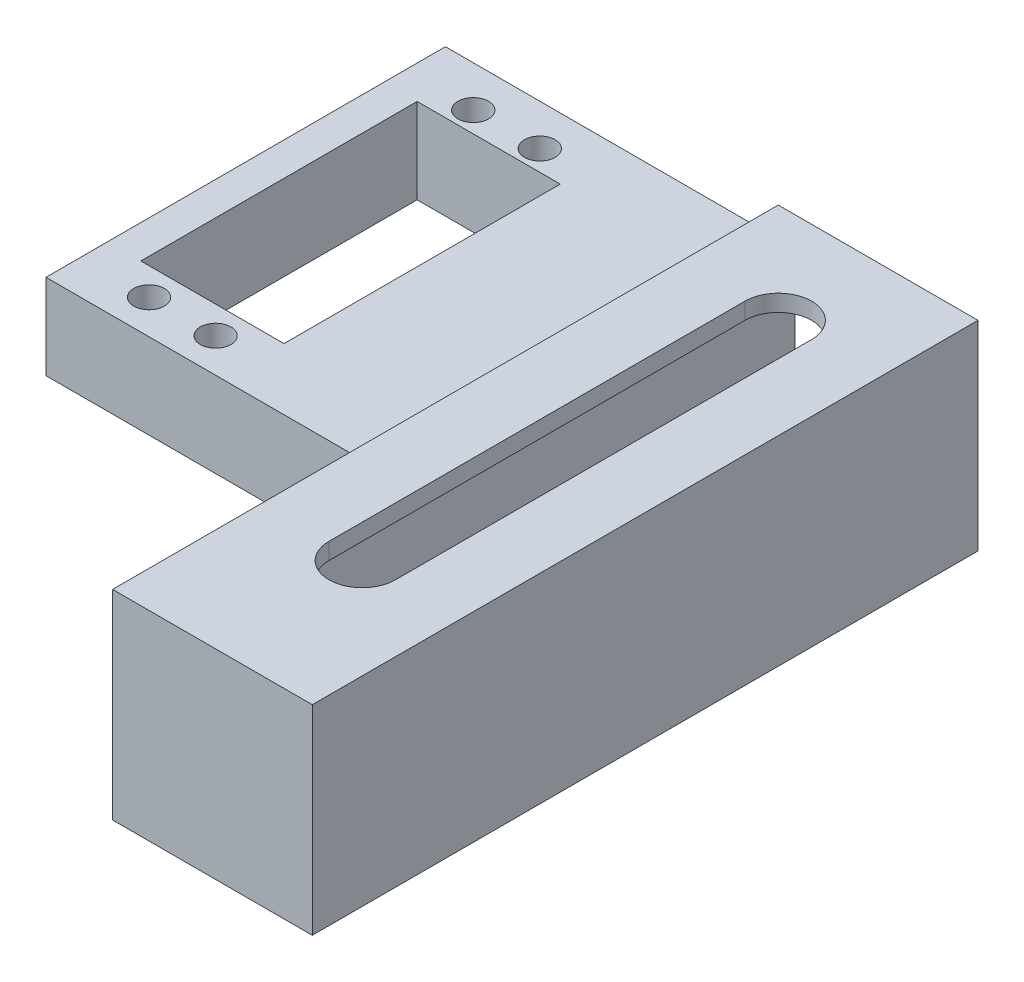
ISO-10303-21;
HEADER;
FILE_DESCRIPTION(('STEP AP214'),'2;1');
FILE_NAME('part.step','',(''),(''),'','','');
FILE_SCHEMA(('AUTOMOTIVE_DESIGN { 1 0 10303 214 1 1 1 1 }'));
ENDSEC;
DATA;
#1=APPLICATION_CONTEXT('core data for automotive mechanical design processes');
#2=APPLICATION_PROTOCOL_DEFINITION('international standard','automotive_design',2000,#1);
#3=PRODUCT_CONTEXT('',#1,'mechanical');
#4=PRODUCT('Part','Part','',(#3));
#5=PRODUCT_RELATED_PRODUCT_CATEGORY('part','',(#4));
#6=PRODUCT_DEFINITION_FORMATION('','',#4);
#7=PRODUCT_DEFINITION_CONTEXT('part definition',#1,'design');
#8=PRODUCT_DEFINITION('design','',#6,#7);
#9=PRODUCT_DEFINITION_SHAPE('','',#8);
#10=(LENGTH_UNIT() NAMED_UNIT(*) SI_UNIT(.MILLI.,.METRE.));
#11=(NAMED_UNIT(*) PLANE_ANGLE_UNIT() SI_UNIT($,.RADIAN.));
#12=(NAMED_UNIT(*) SI_UNIT($,.STERADIAN.) SOLID_ANGLE_UNIT());
#13=UNCERTAINTY_MEASURE_WITH_UNIT(LENGTH_MEASURE(1.E-05),#10,'distance_accuracy_value','');
#14=(GEOMETRIC_REPRESENTATION_CONTEXT(3) GLOBAL_UNCERTAINTY_ASSIGNED_CONTEXT((#13)) GLOBAL_UNIT_ASSIGNED_CONTEXT((#10,
#11,#12)) REPRESENTATION_CONTEXT('',''));
#15=CARTESIAN_POINT('',(0.,0.,0.));
#16=DIRECTION('',(0.,0.,1.));
#17=DIRECTION('',(1.,0.,0.));
#18=AXIS2_PLACEMENT_3D('',#15,#16,#17);
#19=CARTESIAN_POINT('',(-30.,0.,100.));
#20=DIRECTION('',(1.,0.,0.));
#21=DIRECTION('',(0.,0.,-1.));
#22=AXIS2_PLACEMENT_3D('',#19,#20,#21);
#23=PLANE('',#22);
#24=DIRECTION('',(0.,1.,0.));
#25=VECTOR('',#24,1.);
#26=CARTESIAN_POINT('',(-30.,-4.4,60.));
#27=LINE('',#26,#25);
#28=CARTESIAN_POINT('',(-30.,-17.2,60.));
#29=VERTEX_POINT('',#28);
#30=CARTESIAN_POINT('',(-30.,-4.4,60.));
#31=VERTEX_POINT('',#30);
#32=EDGE_CURVE('E257',#29,#31,#27,.T.);
#33=ORIENTED_EDGE('',*,*,#32,.F.);
#34=DIRECTION('',(0.,0.,-1.));
#35=VECTOR('',#34,1.);
#36=CARTESIAN_POINT('',(-30.,-17.2,100.));
#37=LINE('',#36,#35);
#38=CARTESIAN_POINT('',(-30.,-17.2,0.));
#39=VERTEX_POINT('',#38);
#40=EDGE_CURVE('E190',#29,#39,#37,.T.);
#41=ORIENTED_EDGE('',*,*,#40,.T.);
#42=DIRECTION('',(0.,-1.,0.));
#43=VECTOR('',#42,1.);
#44=CARTESIAN_POINT('',(-30.,-17.2,0.));
#45=LINE('',#44,#43);
#46=CARTESIAN_POINT('',(-30.,-30.,0.));
#47=VERTEX_POINT('',#46);
#48=EDGE_CURVE('E188',#39,#47,#45,.T.);
#49=ORIENTED_EDGE('',*,*,#48,.T.);
#50=DIRECTION('',(0.,0.,-1.));
#51=VECTOR('',#50,1.);
#52=CARTESIAN_POINT('',(-30.,-30.,100.));
#53=LINE('',#52,#51);
#54=CARTESIAN_POINT('',(-30.,-30.,100.));
#55=VERTEX_POINT('',#54);
#56=EDGE_CURVE('E174',#55,#47,#53,.T.);
#57=ORIENTED_EDGE('',*,*,#56,.F.);
#58=DIRECTION('',(0.,-1.,0.));
#59=VECTOR('',#58,1.);
#60=CARTESIAN_POINT('',(-30.,0.,100.));
#61=LINE('',#60,#59);
#62=CARTESIAN_POINT('',(-30.,0.,100.));
#63=VERTEX_POINT('',#62);
#64=EDGE_CURVE('E329',#63,#55,#61,.T.);
#65=ORIENTED_EDGE('',*,*,#64,.F.);
#66=DIRECTION('',(0.,0.,-1.));
#67=VECTOR('',#66,1.);
#68=CARTESIAN_POINT('',(-30.,0.,100.));
#69=LINE('',#68,#67);
#70=CARTESIAN_POINT('',(-30.,0.,0.));
#71=VERTEX_POINT('',#70);
#72=EDGE_CURVE('E184',#63,#71,#69,.T.);
#73=ORIENTED_EDGE('',*,*,#72,.T.);
#74=DIRECTION('',(0.,-1.,0.));
#75=VECTOR('',#74,1.);
#76=CARTESIAN_POINT('',(-30.,0.,0.));
#77=LINE('',#76,#75);
#78=CARTESIAN_POINT('',(-30.,-4.4,0.));
#79=VERTEX_POINT('',#78);
#80=EDGE_CURVE('E202',#71,#79,#77,.T.);
#81=ORIENTED_EDGE('',*,*,#80,.T.);
#82=DIRECTION('',(0.,0.,-1.));
#83=VECTOR('',#82,1.);
#84=CARTESIAN_POINT('',(-30.,-4.4,60.));
#85=LINE('',#84,#83);
#86=EDGE_CURVE('E251',#31,#79,#85,.T.);
#87=ORIENTED_EDGE('',*,*,#86,.F.);
#88=EDGE_LOOP('',(#33,#41,#49,#57,#65,#73,#81,#87));
#89=FACE_BOUND('',#88,.T.);
#90=ADVANCED_FACE('F35',(#89),#23,.F.);
#91=CARTESIAN_POINT('',(0.,0.,100.));
#92=DIRECTION('',(-1.,0.,0.));
#93=DIRECTION('',(0.,0.,1.));
#94=AXIS2_PLACEMENT_3D('',#91,#92,#93);
#95=PLANE('',#94);
#96=DIRECTION('',(0.,1.,0.));
#97=VECTOR('',#96,1.);
#98=CARTESIAN_POINT('',(0.,0.,0.));
#99=LINE('',#98,#97);
#100=CARTESIAN_POINT('',(0.,-30.,0.));
#101=VERTEX_POINT('',#100);
#102=CARTESIAN_POINT('',(0.,0.,0.));
#103=VERTEX_POINT('',#102);
#104=EDGE_CURVE('E200',#101,#103,#99,.T.);
#105=ORIENTED_EDGE('',*,*,#104,.T.);
#106=DIRECTION('',(0.,0.,-1.));
#107=VECTOR('',#106,1.);
#108=CARTESIAN_POINT('',(0.,0.,100.));
#109=LINE('',#108,#107);
#110=CARTESIAN_POINT('',(0.,0.,100.));
#111=VERTEX_POINT('',#110);
#112=EDGE_CURVE('E214',#111,#103,#109,.T.);
#113=ORIENTED_EDGE('',*,*,#112,.F.);
#114=DIRECTION('',(0.,1.,0.));
#115=VECTOR('',#114,1.);
#116=CARTESIAN_POINT('',(0.,0.,100.));
#117=LINE('',#116,#115);
#118=CARTESIAN_POINT('',(0.,-30.,100.));
#119=VERTEX_POINT('',#118);
#120=EDGE_CURVE('E201',#119,#111,#117,.T.);
#121=ORIENTED_EDGE('',*,*,#120,.F.);
#122=DIRECTION('',(0.,0.,-1.));
#123=VECTOR('',#122,1.);
#124=CARTESIAN_POINT('',(0.,-30.,100.));
#125=LINE('',#124,#123);
#126=EDGE_CURVE('E185',#119,#101,#125,.T.);
#127=ORIENTED_EDGE('',*,*,#126,.T.);
#128=EDGE_LOOP('',(#105,#113,#121,#127));
#129=FACE_BOUND('',#128,.T.);
#130=ADVANCED_FACE('F37',(#129),#95,.F.);
#131=CARTESIAN_POINT('',(0.,0.,100.));
#132=DIRECTION('',(0.,-1.,0.));
#133=DIRECTION('',(0.,0.,-1.));
#134=AXIS2_PLACEMENT_3D('',#131,#132,#133);
#135=PLANE('',#134);
#136=DIRECTION('',(0.,0.,1.));
#137=VECTOR('',#136,1.);
#138=CARTESIAN_POINT('',(-20.,0.,15.));
#139=LINE('',#138,#137);
#140=CARTESIAN_POINT('',(-20.,0.,15.));
#141=VERTEX_POINT('',#140);
#142=CARTESIAN_POINT('',(-20.,0.,77.5));
#143=VERTEX_POINT('',#142);
#144=EDGE_CURVE('E278',#141,#143,#139,.T.);
#145=ORIENTED_EDGE('',*,*,#144,.F.);
#146=CARTESIAN_POINT('',(-15.,0.,15.));
#147=DIRECTION('',(0.,1.,0.));
#148=DIRECTION('',(0.,0.,1.));
#149=AXIS2_PLACEMENT_3D('',#146,#147,#148);
#150=CIRCLE('',#149,5.);
#151=CARTESIAN_POINT('',(-10.,0.,15.));
#152=VERTEX_POINT('',#151);
#153=EDGE_CURVE('E267',#152,#141,#150,.T.);
#154=ORIENTED_EDGE('',*,*,#153,.F.);
#155=DIRECTION('',(0.,0.,-1.));
#156=VECTOR('',#155,1.);
#157=CARTESIAN_POINT('',(-10.,0.,15.));
#158=LINE('',#157,#156);
#159=CARTESIAN_POINT('',(-9.99999999999999,0.,77.5));
#160=VERTEX_POINT('',#159);
#161=EDGE_CURVE('E284',#160,#152,#158,.T.);
#162=ORIENTED_EDGE('',*,*,#161,.F.);
#163=CARTESIAN_POINT('',(-15.,0.,77.5));
#164=DIRECTION('',(0.,1.,0.));
#165=DIRECTION('',(0.,0.,1.));
#166=AXIS2_PLACEMENT_3D('',#163,#164,#165);
#167=CIRCLE('',#166,5.);
#168=EDGE_CURVE('E281',#143,#160,#167,.T.);
#169=ORIENTED_EDGE('',*,*,#168,.F.);
#170=EDGE_LOOP('',(#145,#154,#162,#169));
#171=FACE_BOUND('',#170,.T.);
#172=DIRECTION('',(-1.,0.,0.));
#173=VECTOR('',#172,1.);
#174=CARTESIAN_POINT('',(0.,0.,0.));
#175=LINE('',#174,#173);
#176=EDGE_CURVE('E207',#103,#71,#175,.T.);
#177=ORIENTED_EDGE('',*,*,#176,.T.);
#178=ORIENTED_EDGE('',*,*,#72,.F.);
#179=DIRECTION('',(-1.,0.,0.));
#180=VECTOR('',#179,1.);
#181=CARTESIAN_POINT('',(0.,0.,100.));
#182=LINE('',#181,#180);
#183=EDGE_CURVE('E205',#111,#63,#182,.T.);
#184=ORIENTED_EDGE('',*,*,#183,.F.);
#185=ORIENTED_EDGE('',*,*,#112,.T.);
#186=EDGE_LOOP('',(#177,#178,#184,#185));
#187=FACE_BOUND('',#186,.T.);
#188=ADVANCED_FACE('F334',(#171,#187),#135,.F.);
#189=CARTESIAN_POINT('',(0.,-30.,100.));
#190=DIRECTION('',(0.,1.,0.));
#191=DIRECTION('',(0.,0.,1.));
#192=AXIS2_PLACEMENT_3D('',#189,#190,#191);
#193=PLANE('',#192);
#194=ORIENTED_EDGE('',*,*,#56,.T.);
#195=DIRECTION('',(1.,0.,0.));
#196=VECTOR('',#195,1.);
#197=CARTESIAN_POINT('',(0.,-30.,0.));
#198=LINE('',#197,#196);
#199=EDGE_CURVE('E179',#47,#101,#198,.T.);
#200=ORIENTED_EDGE('',*,*,#199,.T.);
#201=ORIENTED_EDGE('',*,*,#126,.F.);
#202=DIRECTION('',(1.,0.,0.));
#203=VECTOR('',#202,1.);
#204=CARTESIAN_POINT('',(0.,-30.,100.));
#205=LINE('',#204,#203);
#206=EDGE_CURVE('E181',#55,#119,#205,.T.);
#207=ORIENTED_EDGE('',*,*,#206,.F.);
#208=EDGE_LOOP('',(#194,#200,#201,#207));
#209=FACE_BOUND('',#208,.T.);
#210=ADVANCED_FACE('F176',(#209),#193,.F.);
#211=CARTESIAN_POINT('',(0.,0.,100.));
#212=DIRECTION('',(0.,0.,-1.));
#213=DIRECTION('',(-1.,0.,0.));
#214=AXIS2_PLACEMENT_3D('',#211,#212,#213);
#215=PLANE('',#214);
#216=ORIENTED_EDGE('',*,*,#120,.T.);
#217=ORIENTED_EDGE('',*,*,#183,.T.);
#218=ORIENTED_EDGE('',*,*,#64,.T.);
#219=ORIENTED_EDGE('',*,*,#206,.T.);
#220=EDGE_LOOP('',(#216,#217,#218,#219));
#221=FACE_BOUND('',#220,.T.);
#222=ADVANCED_FACE('F390',(#221),#215,.F.);
#223=CARTESIAN_POINT('',(0.,0.,0.));
#224=DIRECTION('',(0.,0.,-1.));
#225=DIRECTION('',(-1.,0.,0.));
#226=AXIS2_PLACEMENT_3D('',#223,#224,#225);
#227=PLANE('',#226);
#228=ORIENTED_EDGE('',*,*,#48,.F.);
#229=DIRECTION('',(1.,0.,0.));
#230=VECTOR('',#229,1.);
#231=CARTESIAN_POINT('',(-30.,-17.2,0.));
#232=LINE('',#231,#230);
#233=CARTESIAN_POINT('',(-80.,-17.2,0.));
#234=VERTEX_POINT('',#233);
#235=EDGE_CURVE('E194',#234,#39,#232,.T.);
#236=ORIENTED_EDGE('',*,*,#235,.F.);
#237=DIRECTION('',(0.,-1.,0.));
#238=VECTOR('',#237,1.);
#239=CARTESIAN_POINT('',(-80.,-4.4,0.));
#240=LINE('',#239,#238);
#241=CARTESIAN_POINT('',(-80.,-4.4,0.));
#242=VERTEX_POINT('',#241);
#243=EDGE_CURVE('E253',#242,#234,#240,.T.);
#244=ORIENTED_EDGE('',*,*,#243,.F.);
#245=DIRECTION('',(1.,0.,0.));
#246=VECTOR('',#245,1.);
#247=CARTESIAN_POINT('',(-80.,-4.4,0.));
#248=LINE('',#247,#246);
#249=EDGE_CURVE('E256',#242,#79,#248,.T.);
#250=ORIENTED_EDGE('',*,*,#249,.T.);
#251=ORIENTED_EDGE('',*,*,#80,.F.);
#252=ORIENTED_EDGE('',*,*,#176,.F.);
#253=ORIENTED_EDGE('',*,*,#104,.F.);
#254=ORIENTED_EDGE('',*,*,#199,.F.);
#255=EDGE_LOOP('',(#228,#236,#244,#250,#251,#252,#253,#254));
#256=FACE_BOUND('',#255,.T.);
#257=DIRECTION('',(0.,-1.,0.));
#258=VECTOR('',#257,1.);
#259=CARTESIAN_POINT('',(-2.5,-2.5,0.));
#260=LINE('',#259,#258);
#261=CARTESIAN_POINT('',(-2.5,-2.5,0.));
#262=VERTEX_POINT('',#261);
#263=CARTESIAN_POINT('',(-2.5,-27.5,0.));
#264=VERTEX_POINT('',#263);
#265=EDGE_CURVE('E296',#262,#264,#260,.T.);
#266=ORIENTED_EDGE('',*,*,#265,.F.);
#267=DIRECTION('',(1.,0.,0.));
#268=VECTOR('',#267,1.);
#269=CARTESIAN_POINT('',(-2.5,-2.5,0.));
#270=LINE('',#269,#268);
#271=CARTESIAN_POINT('',(-27.5,-2.5,0.));
#272=VERTEX_POINT('',#271);
#273=EDGE_CURVE('E301',#272,#262,#270,.T.);
#274=ORIENTED_EDGE('',*,*,#273,.F.);
#275=DIRECTION('',(0.,1.,0.));
#276=VECTOR('',#275,1.);
#277=CARTESIAN_POINT('',(-27.5,-2.5,0.));
#278=LINE('',#277,#276);
#279=CARTESIAN_POINT('',(-27.5,-27.5,0.));
#280=VERTEX_POINT('',#279);
#281=EDGE_CURVE('E315',#280,#272,#278,.T.);
#282=ORIENTED_EDGE('',*,*,#281,.F.);
#283=DIRECTION('',(-1.,0.,0.));
#284=VECTOR('',#283,1.);
#285=CARTESIAN_POINT('',(-2.5,-27.5,0.));
#286=LINE('',#285,#284);
#287=EDGE_CURVE('E312',#264,#280,#286,.T.);
#288=ORIENTED_EDGE('',*,*,#287,.F.);
#289=EDGE_LOOP('',(#266,#274,#282,#288));
#290=FACE_BOUND('',#289,.T.);
#291=ADVANCED_FACE('F197',(#256,#290),#227,.T.);
#292=CARTESIAN_POINT('',(-2.5,-2.5,95.));
#293=DIRECTION('',(1.,0.,0.));
#294=DIRECTION('',(0.,1.,0.));
#295=AXIS2_PLACEMENT_3D('',#292,#293,#294);
#296=PLANE('',#295);
#297=ORIENTED_EDGE('',*,*,#265,.T.);
#298=DIRECTION('',(0.,0.,-1.));
#299=VECTOR('',#298,1.);
#300=CARTESIAN_POINT('',(-2.5,-27.5,95.));
#301=LINE('',#300,#299);
#302=CARTESIAN_POINT('',(-2.5,-27.5,95.));
#303=VERTEX_POINT('',#302);
#304=EDGE_CURVE('E310',#303,#264,#301,.T.);
#305=ORIENTED_EDGE('',*,*,#304,.F.);
#306=DIRECTION('',(0.,-1.,0.));
#307=VECTOR('',#306,1.);
#308=CARTESIAN_POINT('',(-2.5,-2.5,95.));
#309=LINE('',#308,#307);
#310=CARTESIAN_POINT('',(-2.5,-2.5,95.));
#311=VERTEX_POINT('',#310);
#312=EDGE_CURVE('E297',#311,#303,#309,.T.);
#313=ORIENTED_EDGE('',*,*,#312,.F.);
#314=DIRECTION('',(0.,0.,-1.));
#315=VECTOR('',#314,1.);
#316=CARTESIAN_POINT('',(-2.5,-2.5,95.));
#317=LINE('',#316,#315);
#318=EDGE_CURVE('E320',#311,#262,#317,.T.);
#319=ORIENTED_EDGE('',*,*,#318,.T.);
#320=EDGE_LOOP('',(#297,#305,#313,#319));
#321=FACE_BOUND('',#320,.T.);
#322=ADVANCED_FACE('F433',(#321),#296,.F.);
#323=CARTESIAN_POINT('',(-2.5,-2.5,95.));
#324=DIRECTION('',(0.,1.,0.));
#325=DIRECTION('',(-1.,0.,0.));
#326=AXIS2_PLACEMENT_3D('',#323,#324,#325);
#327=PLANE('',#326);
#328=DIRECTION('',(0.,0.,1.));
#329=VECTOR('',#328,1.);
#330=CARTESIAN_POINT('',(-10.,-2.5,15.));
#331=LINE('',#330,#329);
#332=CARTESIAN_POINT('',(-10.,-2.5,15.));
#333=VERTEX_POINT('',#332);
#334=CARTESIAN_POINT('',(-9.99999999999999,-2.5,77.5));
#335=VERTEX_POINT('',#334);
#336=EDGE_CURVE('E271',#333,#335,#331,.T.);
#337=ORIENTED_EDGE('',*,*,#336,.F.);
#338=CARTESIAN_POINT('',(-15.,-2.5,15.));
#339=DIRECTION('',(0.,1.,0.));
#340=DIRECTION('',(-1.,0.,0.));
#341=AXIS2_PLACEMENT_3D('',#338,#339,#340);
#342=CIRCLE('',#341,5.);
#343=CARTESIAN_POINT('',(-20.,-2.5,15.));
#344=VERTEX_POINT('',#343);
#345=EDGE_CURVE('E274',#344,#333,#342,.F.);
#346=ORIENTED_EDGE('',*,*,#345,.F.);
#347=DIRECTION('',(0.,0.,-1.));
#348=VECTOR('',#347,1.);
#349=CARTESIAN_POINT('',(-20.,-2.5,15.));
#350=LINE('',#349,#348);
#351=CARTESIAN_POINT('',(-20.,-2.5,77.5));
#352=VERTEX_POINT('',#351);
#353=EDGE_CURVE('E276',#352,#344,#350,.T.);
#354=ORIENTED_EDGE('',*,*,#353,.F.);
#355=CARTESIAN_POINT('',(-15.,-2.5,77.5));
#356=DIRECTION('',(0.,1.,0.));
#357=DIRECTION('',(-1.,0.,0.));
#358=AXIS2_PLACEMENT_3D('',#355,#356,#357);
#359=CIRCLE('',#358,5.);
#360=EDGE_CURVE('E268',#335,#352,#359,.F.);
#361=ORIENTED_EDGE('',*,*,#360,.F.);
#362=EDGE_LOOP('',(#337,#346,#354,#361));
#363=FACE_BOUND('',#362,.T.);
#364=ORIENTED_EDGE('',*,*,#273,.T.);
#365=ORIENTED_EDGE('',*,*,#318,.F.);
#366=DIRECTION('',(1.,0.,0.));
#367=VECTOR('',#366,1.);
#368=CARTESIAN_POINT('',(-2.5,-2.5,95.));
#369=LINE('',#368,#367);
#370=CARTESIAN_POINT('',(-27.5,-2.5,95.));
#371=VERTEX_POINT('',#370);
#372=EDGE_CURVE('E307',#371,#311,#369,.T.);
#373=ORIENTED_EDGE('',*,*,#372,.F.);
#374=DIRECTION('',(0.,0.,-1.));
#375=VECTOR('',#374,1.);
#376=CARTESIAN_POINT('',(-27.5,-2.5,95.));
#377=LINE('',#376,#375);
#378=EDGE_CURVE('E322',#371,#272,#377,.T.);
#379=ORIENTED_EDGE('',*,*,#378,.T.);
#380=EDGE_LOOP('',(#364,#365,#373,#379));
#381=FACE_BOUND('',#380,.T.);
#382=ADVANCED_FACE('F405',(#363,#381),#327,.F.);
#383=CARTESIAN_POINT('',(-27.5,-2.5,95.));
#384=DIRECTION('',(-1.,0.,0.));
#385=DIRECTION('',(0.,-1.,0.));
#386=AXIS2_PLACEMENT_3D('',#383,#384,#385);
#387=PLANE('',#386);
#388=ORIENTED_EDGE('',*,*,#281,.T.);
#389=ORIENTED_EDGE('',*,*,#378,.F.);
#390=DIRECTION('',(0.,1.,0.));
#391=VECTOR('',#390,1.);
#392=CARTESIAN_POINT('',(-27.5,-2.5,95.));
#393=LINE('',#392,#391);
#394=CARTESIAN_POINT('',(-27.5,-27.5,95.));
#395=VERTEX_POINT('',#394);
#396=EDGE_CURVE('E304',#395,#371,#393,.T.);
#397=ORIENTED_EDGE('',*,*,#396,.F.);
#398=DIRECTION('',(0.,0.,-1.));
#399=VECTOR('',#398,1.);
#400=CARTESIAN_POINT('',(-27.5,-27.5,95.));
#401=LINE('',#400,#399);
#402=EDGE_CURVE('E324',#395,#280,#401,.T.);
#403=ORIENTED_EDGE('',*,*,#402,.T.);
#404=EDGE_LOOP('',(#388,#389,#397,#403));
#405=FACE_BOUND('',#404,.T.);
#406=ADVANCED_FACE('F432',(#405),#387,.F.);
#407=CARTESIAN_POINT('',(-2.5,-27.5,95.));
#408=DIRECTION('',(0.,-1.,0.));
#409=DIRECTION('',(0.,0.,-1.));
#410=AXIS2_PLACEMENT_3D('',#407,#408,#409);
#411=PLANE('',#410);
#412=ORIENTED_EDGE('',*,*,#287,.T.);
#413=ORIENTED_EDGE('',*,*,#402,.F.);
#414=DIRECTION('',(-1.,0.,0.));
#415=VECTOR('',#414,1.);
#416=CARTESIAN_POINT('',(-2.5,-27.5,95.));
#417=LINE('',#416,#415);
#418=EDGE_CURVE('E300',#303,#395,#417,.T.);
#419=ORIENTED_EDGE('',*,*,#418,.F.);
#420=ORIENTED_EDGE('',*,*,#304,.T.);
#421=EDGE_LOOP('',(#412,#413,#419,#420));
#422=FACE_BOUND('',#421,.T.);
#423=ADVANCED_FACE('F428',(#422),#411,.F.);
#424=CARTESIAN_POINT('',(0.,0.,95.));
#425=DIRECTION('',(0.,0.,-1.));
#426=DIRECTION('',(-1.,0.,0.));
#427=AXIS2_PLACEMENT_3D('',#424,#425,#426);
#428=PLANE('',#427);
#429=ORIENTED_EDGE('',*,*,#312,.T.);
#430=ORIENTED_EDGE('',*,*,#418,.T.);
#431=ORIENTED_EDGE('',*,*,#396,.T.);
#432=ORIENTED_EDGE('',*,*,#372,.T.);
#433=EDGE_LOOP('',(#429,#430,#431,#432));
#434=FACE_BOUND('',#433,.T.);
#435=ADVANCED_FACE('F425',(#434),#428,.T.);
#436=CARTESIAN_POINT('',(-15.,-75.6864058415223,15.));
#437=DIRECTION('',(0.,1.,0.));
#438=DIRECTION('',(0.,0.,1.));
#439=AXIS2_PLACEMENT_3D('',#436,#437,#438);
#440=CYLINDRICAL_SURFACE('',#439,5.);
#441=ORIENTED_EDGE('',*,*,#345,.T.);
#442=DIRECTION('',(0.,1.,0.));
#443=VECTOR('',#442,1.);
#444=CARTESIAN_POINT('',(-10.,-75.6864058415223,15.));
#445=LINE('',#444,#443);
#446=EDGE_CURVE('E272',#333,#152,#445,.T.);
#447=ORIENTED_EDGE('',*,*,#446,.T.);
#448=ORIENTED_EDGE('',*,*,#153,.T.);
#449=DIRECTION('',(0.,1.,0.));
#450=VECTOR('',#449,1.);
#451=CARTESIAN_POINT('',(-20.,-75.6864058415223,15.));
#452=LINE('',#451,#450);
#453=EDGE_CURVE('E287',#344,#141,#452,.T.);
#454=ORIENTED_EDGE('',*,*,#453,.F.);
#455=EDGE_LOOP('',(#441,#447,#448,#454));
#456=FACE_BOUND('',#455,.T.);
#457=ADVANCED_FACE('F401',(#456),#440,.F.);
#458=CARTESIAN_POINT('',(-10.,-75.6864058415223,15.));
#459=DIRECTION('',(1.,0.,0.));
#460=DIRECTION('',(0.,0.,-1.));
#461=AXIS2_PLACEMENT_3D('',#458,#459,#460);
#462=PLANE('',#461);
#463=ORIENTED_EDGE('',*,*,#336,.T.);
#464=DIRECTION('',(0.,1.,0.));
#465=VECTOR('',#464,1.);
#466=CARTESIAN_POINT('',(-9.99999999999999,-75.6864058415223,77.5));
#467=LINE('',#466,#465);
#468=EDGE_CURVE('E289',#335,#160,#467,.T.);
#469=ORIENTED_EDGE('',*,*,#468,.T.);
#470=ORIENTED_EDGE('',*,*,#161,.T.);
#471=ORIENTED_EDGE('',*,*,#446,.F.);
#472=EDGE_LOOP('',(#463,#469,#470,#471));
#473=FACE_BOUND('',#472,.T.);
#474=ADVANCED_FACE('F410',(#473),#462,.F.);
#475=CARTESIAN_POINT('',(-15.,-75.6864058415223,77.5));
#476=DIRECTION('',(0.,1.,0.));
#477=DIRECTION('',(0.,0.,1.));
#478=AXIS2_PLACEMENT_3D('',#475,#476,#477);
#479=CYLINDRICAL_SURFACE('',#478,5.);
#480=ORIENTED_EDGE('',*,*,#360,.T.);
#481=DIRECTION('',(0.,1.,0.));
#482=VECTOR('',#481,1.);
#483=CARTESIAN_POINT('',(-20.,-75.6864058415223,77.5));
#484=LINE('',#483,#482);
#485=EDGE_CURVE('E291',#352,#143,#484,.T.);
#486=ORIENTED_EDGE('',*,*,#485,.T.);
#487=ORIENTED_EDGE('',*,*,#168,.T.);
#488=ORIENTED_EDGE('',*,*,#468,.F.);
#489=EDGE_LOOP('',(#480,#486,#487,#488));
#490=FACE_BOUND('',#489,.T.);
#491=ADVANCED_FACE('F412',(#490),#479,.F.);
#492=CARTESIAN_POINT('',(-20.,-75.6864058415223,15.));
#493=DIRECTION('',(-1.,0.,0.));
#494=DIRECTION('',(0.,0.,1.));
#495=AXIS2_PLACEMENT_3D('',#492,#493,#494);
#496=PLANE('',#495);
#497=ORIENTED_EDGE('',*,*,#353,.T.);
#498=ORIENTED_EDGE('',*,*,#453,.T.);
#499=ORIENTED_EDGE('',*,*,#144,.T.);
#500=ORIENTED_EDGE('',*,*,#485,.F.);
#501=EDGE_LOOP('',(#497,#498,#499,#500));
#502=FACE_BOUND('',#501,.T.);
#503=ADVANCED_FACE('F396',(#502),#496,.F.);
#504=CARTESIAN_POINT('',(-80.,-4.4,60.));
#505=DIRECTION('',(0.,0.,-1.));
#506=DIRECTION('',(-1.,0.,0.));
#507=AXIS2_PLACEMENT_3D('',#504,#505,#506);
#508=PLANE('',#507);
#509=DIRECTION('',(0.,1.,0.));
#510=VECTOR('',#509,1.);
#511=CARTESIAN_POINT('',(-80.,-4.4,60.));
#512=LINE('',#511,#510);
#513=CARTESIAN_POINT('',(-80.,-17.2,60.));
#514=VERTEX_POINT('',#513);
#515=CARTESIAN_POINT('',(-80.,-4.4,60.));
#516=VERTEX_POINT('',#515);
#517=EDGE_CURVE('E248',#514,#516,#512,.T.);
#518=ORIENTED_EDGE('',*,*,#517,.F.);
#519=DIRECTION('',(1.,0.,0.));
#520=VECTOR('',#519,1.);
#521=CARTESIAN_POINT('',(-80.,-17.2,60.));
#522=LINE('',#521,#520);
#523=EDGE_CURVE('E52',#514,#29,#522,.T.);
#524=ORIENTED_EDGE('',*,*,#523,.T.);
#525=ORIENTED_EDGE('',*,*,#32,.T.);
#526=DIRECTION('',(1.,0.,0.));
#527=VECTOR('',#526,1.);
#528=CARTESIAN_POINT('',(-80.,-4.4,60.));
#529=LINE('',#528,#527);
#530=EDGE_CURVE('E264',#516,#31,#529,.T.);
#531=ORIENTED_EDGE('',*,*,#530,.F.);
#532=EDGE_LOOP('',(#518,#524,#525,#531));
#533=FACE_BOUND('',#532,.T.);
#534=ADVANCED_FACE('F346',(#533),#508,.F.);
#535=CARTESIAN_POINT('',(-80.,-4.4,60.));
#536=DIRECTION('',(0.,-1.,0.));
#537=DIRECTION('',(0.,0.,-1.));
#538=AXIS2_PLACEMENT_3D('',#535,#536,#537);
#539=PLANE('',#538);
#540=CARTESIAN_POINT('',(-59.66,-4.4,54.86));
#541=DIRECTION('',(0.,-1.,0.));
#542=DIRECTION('',(0.,0.,-1.));
#543=AXIS2_PLACEMENT_3D('',#540,#541,#542);
#544=CIRCLE('',#543,2.30000000000001);
#545=CARTESIAN_POINT('',(-59.66,-4.4,52.56));
#546=VERTEX_POINT('',#545);
#547=EDGE_CURVE('E233',#546,#546,#544,.T.);
#548=ORIENTED_EDGE('',*,*,#547,.T.);
#549=EDGE_LOOP('',(#548));
#550=FACE_BOUND('',#549,.T.);
#551=CARTESIAN_POINT('',(-69.66,-4.4,6.16000000000001));
#552=DIRECTION('',(0.,-1.,0.));
#553=DIRECTION('',(0.,0.,-1.));
#554=AXIS2_PLACEMENT_3D('',#551,#552,#553);
#555=CIRCLE('',#554,2.30000000000001);
#556=CARTESIAN_POINT('',(-69.66,-4.4,3.86));
#557=VERTEX_POINT('',#556);
#558=EDGE_CURVE('E231',#557,#557,#555,.T.);
#559=ORIENTED_EDGE('',*,*,#558,.T.);
#560=EDGE_LOOP('',(#559));
#561=FACE_BOUND('',#560,.T.);
#562=CARTESIAN_POINT('',(-59.66,-4.4,6.16000000000001));
#563=DIRECTION('',(0.,-1.,0.));
#564=DIRECTION('',(0.,0.,-1.));
#565=AXIS2_PLACEMENT_3D('',#562,#563,#564);
#566=CIRCLE('',#565,2.30000000000001);
#567=CARTESIAN_POINT('',(-59.66,-4.4,3.86));
#568=VERTEX_POINT('',#567);
#569=EDGE_CURVE('E228',#568,#568,#566,.T.);
#570=ORIENTED_EDGE('',*,*,#569,.T.);
#571=EDGE_LOOP('',(#570));
#572=FACE_BOUND('',#571,.T.);
#573=CARTESIAN_POINT('',(-69.66,-4.4,54.86));
#574=DIRECTION('',(0.,-1.,0.));
#575=DIRECTION('',(0.,0.,-1.));
#576=AXIS2_PLACEMENT_3D('',#573,#574,#575);
#577=CIRCLE('',#576,2.29999999999999);
#578=CARTESIAN_POINT('',(-69.66,-4.4,52.56));
#579=VERTEX_POINT('',#578);
#580=EDGE_CURVE('E225',#579,#579,#577,.T.);
#581=ORIENTED_EDGE('',*,*,#580,.T.);
#582=EDGE_LOOP('',(#581));
#583=FACE_BOUND('',#582,.T.);
#584=DIRECTION('',(-1.,0.,0.));
#585=VECTOR('',#584,1.);
#586=CARTESIAN_POINT('',(-80.,-4.4,50.75));
#587=LINE('',#586,#585);
#588=CARTESIAN_POINT('',(-53.5,-4.4,50.75));
#589=VERTEX_POINT('',#588);
#590=CARTESIAN_POINT('',(-75.,-4.4,50.75));
#591=VERTEX_POINT('',#590);
#592=EDGE_CURVE('E217',#589,#591,#587,.T.);
#593=ORIENTED_EDGE('',*,*,#592,.T.);
#594=DIRECTION('',(0.,0.,-1.));
#595=VECTOR('',#594,1.);
#596=CARTESIAN_POINT('',(-75.,-4.4,60.));
#597=LINE('',#596,#595);
#598=CARTESIAN_POINT('',(-75.,-4.4,9.25000000000001));
#599=VERTEX_POINT('',#598);
#600=EDGE_CURVE('E11',#591,#599,#597,.T.);
#601=ORIENTED_EDGE('',*,*,#600,.T.);
#602=DIRECTION('',(1.,0.,0.));
#603=VECTOR('',#602,1.);
#604=CARTESIAN_POINT('',(-80.,-4.4,9.25000000000001));
#605=LINE('',#604,#603);
#606=CARTESIAN_POINT('',(-53.5,-4.4,9.25));
#607=VERTEX_POINT('',#606);
#608=EDGE_CURVE('E44',#599,#607,#605,.T.);
#609=ORIENTED_EDGE('',*,*,#608,.T.);
#610=DIRECTION('',(0.,0.,1.));
#611=VECTOR('',#610,1.);
#612=CARTESIAN_POINT('',(-53.5,-4.4,60.));
#613=LINE('',#612,#611);
#614=EDGE_CURVE('E220',#607,#589,#613,.T.);
#615=ORIENTED_EDGE('',*,*,#614,.T.);
#616=EDGE_LOOP('',(#593,#601,#609,#615));
#617=FACE_BOUND('',#616,.T.);
#618=ORIENTED_EDGE('',*,*,#86,.T.);
#619=ORIENTED_EDGE('',*,*,#249,.F.);
#620=DIRECTION('',(0.,0.,-1.));
#621=VECTOR('',#620,1.);
#622=CARTESIAN_POINT('',(-80.,-4.4,60.));
#623=LINE('',#622,#621);
#624=EDGE_CURVE('E250',#516,#242,#623,.T.);
#625=ORIENTED_EDGE('',*,*,#624,.F.);
#626=ORIENTED_EDGE('',*,*,#530,.T.);
#627=EDGE_LOOP('',(#618,#619,#625,#626));
#628=FACE_BOUND('',#627,.T.);
#629=ADVANCED_FACE('F342',(#550,#561,#572,#583,#617,#628),#539,.F.);
#630=CARTESIAN_POINT('',(-80.,0.,0.));
#631=DIRECTION('',(1.,0.,0.));
#632=DIRECTION('',(0.,0.,-1.));
#633=AXIS2_PLACEMENT_3D('',#630,#631,#632);
#634=PLANE('',#633);
#635=ORIENTED_EDGE('',*,*,#243,.T.);
#636=DIRECTION('',(0.,0.,-1.));
#637=VECTOR('',#636,1.);
#638=CARTESIAN_POINT('',(-80.,-17.2,100.));
#639=LINE('',#638,#637);
#640=EDGE_CURVE('E641',#514,#234,#639,.T.);
#641=ORIENTED_EDGE('',*,*,#640,.F.);
#642=ORIENTED_EDGE('',*,*,#517,.T.);
#643=ORIENTED_EDGE('',*,*,#624,.T.);
#644=EDGE_LOOP('',(#635,#641,#642,#643));
#645=FACE_BOUND('',#644,.T.);
#646=ADVANCED_FACE('F367',(#645),#634,.F.);
#647=CARTESIAN_POINT('',(-75.,-30.,50.75));
#648=DIRECTION('',(-1.,0.,0.));
#649=DIRECTION('',(0.,0.,1.));
#650=AXIS2_PLACEMENT_3D('',#647,#648,#649);
#651=PLANE('',#650);
#652=DIRECTION('',(0.,1.,0.));
#653=VECTOR('',#652,1.);
#654=CARTESIAN_POINT('',(-75.,-30.,50.75));
#655=LINE('',#654,#653);
#656=CARTESIAN_POINT('',(-75.,-17.2,50.75));
#657=VERTEX_POINT('',#656);
#658=EDGE_CURVE('E235',#657,#591,#655,.T.);
#659=ORIENTED_EDGE('',*,*,#658,.F.);
#660=DIRECTION('',(0.,0.,-1.));
#661=VECTOR('',#660,1.);
#662=CARTESIAN_POINT('',(-75.,-17.2,50.75));
#663=LINE('',#662,#661);
#664=CARTESIAN_POINT('',(-75.,-17.2,9.25000000000001));
#665=VERTEX_POINT('',#664);
#666=EDGE_CURVE('E60',#657,#665,#663,.T.);
#667=ORIENTED_EDGE('',*,*,#666,.T.);
#668=DIRECTION('',(0.,1.,0.));
#669=VECTOR('',#668,1.);
#670=CARTESIAN_POINT('',(-75.,-30.,9.25000000000001));
#671=LINE('',#670,#669);
#672=EDGE_CURVE('E259',#665,#599,#671,.T.);
#673=ORIENTED_EDGE('',*,*,#672,.T.);
#674=ORIENTED_EDGE('',*,*,#600,.F.);
#675=EDGE_LOOP('',(#659,#667,#673,#674));
#676=FACE_BOUND('',#675,.T.);
#677=ADVANCED_FACE('F365',(#676),#651,.F.);
#678=CARTESIAN_POINT('',(-75.,-30.,9.25000000000001));
#679=DIRECTION('',(0.,0.,-1.));
#680=DIRECTION('',(-1.,0.,0.));
#681=AXIS2_PLACEMENT_3D('',#678,#679,#680);
#682=PLANE('',#681);
#683=ORIENTED_EDGE('',*,*,#672,.F.);
#684=DIRECTION('',(1.,0.,0.));
#685=VECTOR('',#684,1.);
#686=CARTESIAN_POINT('',(-75.,-17.2,9.25000000000001));
#687=LINE('',#686,#685);
#688=CARTESIAN_POINT('',(-53.5,-17.2,9.25));
#689=VERTEX_POINT('',#688);
#690=EDGE_CURVE('E348',#665,#689,#687,.T.);
#691=ORIENTED_EDGE('',*,*,#690,.T.);
#692=DIRECTION('',(0.,1.,0.));
#693=VECTOR('',#692,1.);
#694=CARTESIAN_POINT('',(-53.5,-30.,9.25));
#695=LINE('',#694,#693);
#696=EDGE_CURVE('E244',#689,#607,#695,.T.);
#697=ORIENTED_EDGE('',*,*,#696,.T.);
#698=ORIENTED_EDGE('',*,*,#608,.F.);
#699=EDGE_LOOP('',(#683,#691,#697,#698));
#700=FACE_BOUND('',#699,.T.);
#701=ADVANCED_FACE('F358',(#700),#682,.F.);
#702=CARTESIAN_POINT('',(-53.5,-30.,50.75));
#703=DIRECTION('',(1.,0.,0.));
#704=DIRECTION('',(0.,0.,-1.));
#705=AXIS2_PLACEMENT_3D('',#702,#703,#704);
#706=PLANE('',#705);
#707=ORIENTED_EDGE('',*,*,#696,.F.);
#708=DIRECTION('',(0.,0.,1.));
#709=VECTOR('',#708,1.);
#710=CARTESIAN_POINT('',(-53.5,-17.2,50.75));
#711=LINE('',#710,#709);
#712=CARTESIAN_POINT('',(-53.5,-17.2,50.75));
#713=VERTEX_POINT('',#712);
#714=EDGE_CURVE('E650',#689,#713,#711,.T.);
#715=ORIENTED_EDGE('',*,*,#714,.T.);
#716=DIRECTION('',(0.,1.,0.));
#717=VECTOR('',#716,1.);
#718=CARTESIAN_POINT('',(-53.5,-30.,50.75));
#719=LINE('',#718,#717);
#720=EDGE_CURVE('E238',#713,#589,#719,.T.);
#721=ORIENTED_EDGE('',*,*,#720,.T.);
#722=ORIENTED_EDGE('',*,*,#614,.F.);
#723=EDGE_LOOP('',(#707,#715,#721,#722));
#724=FACE_BOUND('',#723,.T.);
#725=ADVANCED_FACE('F361',(#724),#706,.F.);
#726=CARTESIAN_POINT('',(-75.,-30.,50.75));
#727=DIRECTION('',(0.,0.,1.));
#728=DIRECTION('',(1.,0.,0.));
#729=AXIS2_PLACEMENT_3D('',#726,#727,#728);
#730=PLANE('',#729);
#731=ORIENTED_EDGE('',*,*,#720,.F.);
#732=DIRECTION('',(-1.,0.,0.));
#733=VECTOR('',#732,1.);
#734=CARTESIAN_POINT('',(-75.,-17.2,50.75));
#735=LINE('',#734,#733);
#736=EDGE_CURVE('E640',#713,#657,#735,.T.);
#737=ORIENTED_EDGE('',*,*,#736,.T.);
#738=ORIENTED_EDGE('',*,*,#658,.T.);
#739=ORIENTED_EDGE('',*,*,#592,.F.);
#740=EDGE_LOOP('',(#731,#737,#738,#739));
#741=FACE_BOUND('',#740,.T.);
#742=ADVANCED_FACE('F567',(#741),#730,.F.);
#743=CARTESIAN_POINT('',(-69.66,-30.,54.86));
#744=DIRECTION('',(0.,1.,0.));
#745=DIRECTION('',(0.,0.,1.));
#746=AXIS2_PLACEMENT_3D('',#743,#744,#745);
#747=CYLINDRICAL_SURFACE('',#746,2.29999999999999);
#748=CARTESIAN_POINT('',(-69.66,-17.2,54.86));
#749=DIRECTION('',(0.,1.,0.));
#750=DIRECTION('',(0.,0.,1.));
#751=AXIS2_PLACEMENT_3D('',#748,#749,#750);
#752=CIRCLE('',#751,2.29999999999999);
#753=CARTESIAN_POINT('',(-69.66,-17.2,57.16));
#754=VERTEX_POINT('',#753);
#755=EDGE_CURVE('E639',#754,#754,#752,.F.);
#756=ORIENTED_EDGE('',*,*,#755,.T.);
#757=EDGE_LOOP('',(#756));
#758=FACE_BOUND('',#757,.T.);
#759=ORIENTED_EDGE('',*,*,#580,.F.);
#760=EDGE_LOOP('',(#759));
#761=FACE_BOUND('',#760,.T.);
#762=ADVANCED_FACE('F576',(#758,#761),#747,.F.);
#763=CARTESIAN_POINT('',(-59.66,-30.,6.16000000000001));
#764=DIRECTION('',(0.,1.,0.));
#765=DIRECTION('',(0.,0.,1.));
#766=AXIS2_PLACEMENT_3D('',#763,#764,#765);
#767=CYLINDRICAL_SURFACE('',#766,2.30000000000001);
#768=CARTESIAN_POINT('',(-59.66,-17.2,6.16000000000001));
#769=DIRECTION('',(0.,1.,0.));
#770=DIRECTION('',(0.,0.,1.));
#771=AXIS2_PLACEMENT_3D('',#768,#769,#770);
#772=CIRCLE('',#771,2.30000000000001);
#773=CARTESIAN_POINT('',(-59.66,-17.2,8.46000000000002));
#774=VERTEX_POINT('',#773);
#775=EDGE_CURVE('E629',#774,#774,#772,.F.);
#776=ORIENTED_EDGE('',*,*,#775,.T.);
#777=EDGE_LOOP('',(#776));
#778=FACE_BOUND('',#777,.T.);
#779=ORIENTED_EDGE('',*,*,#569,.F.);
#780=EDGE_LOOP('',(#779));
#781=FACE_BOUND('',#780,.T.);
#782=ADVANCED_FACE('F584',(#778,#781),#767,.F.);
#783=CARTESIAN_POINT('',(-69.66,-30.,6.16000000000001));
#784=DIRECTION('',(0.,1.,0.));
#785=DIRECTION('',(0.,0.,1.));
#786=AXIS2_PLACEMENT_3D('',#783,#784,#785);
#787=CYLINDRICAL_SURFACE('',#786,2.30000000000001);
#788=CARTESIAN_POINT('',(-69.66,-17.2,6.16000000000001));
#789=DIRECTION('',(0.,1.,0.));
#790=DIRECTION('',(0.,0.,1.));
#791=AXIS2_PLACEMENT_3D('',#788,#789,#790);
#792=CIRCLE('',#791,2.30000000000001);
#793=CARTESIAN_POINT('',(-69.66,-17.2,8.46000000000002));
#794=VERTEX_POINT('',#793);
#795=EDGE_CURVE('E636',#794,#794,#792,.F.);
#796=ORIENTED_EDGE('',*,*,#795,.T.);
#797=EDGE_LOOP('',(#796));
#798=FACE_BOUND('',#797,.T.);
#799=ORIENTED_EDGE('',*,*,#558,.F.);
#800=EDGE_LOOP('',(#799));
#801=FACE_BOUND('',#800,.T.);
#802=ADVANCED_FACE('F594',(#798,#801),#787,.F.);
#803=CARTESIAN_POINT('',(-59.66,-30.,54.86));
#804=DIRECTION('',(0.,1.,0.));
#805=DIRECTION('',(0.,0.,1.));
#806=AXIS2_PLACEMENT_3D('',#803,#804,#805);
#807=CYLINDRICAL_SURFACE('',#806,2.30000000000001);
#808=CARTESIAN_POINT('',(-59.66,-17.2,54.86));
#809=DIRECTION('',(0.,1.,0.));
#810=DIRECTION('',(0.,0.,1.));
#811=AXIS2_PLACEMENT_3D('',#808,#809,#810);
#812=CIRCLE('',#811,2.30000000000001);
#813=CARTESIAN_POINT('',(-59.66,-17.2,57.16));
#814=VERTEX_POINT('',#813);
#815=EDGE_CURVE('E39',#814,#814,#812,.F.);
#816=ORIENTED_EDGE('',*,*,#815,.T.);
#817=EDGE_LOOP('',(#816));
#818=FACE_BOUND('',#817,.T.);
#819=ORIENTED_EDGE('',*,*,#547,.F.);
#820=EDGE_LOOP('',(#819));
#821=FACE_BOUND('',#820,.T.);
#822=ADVANCED_FACE('F604',(#818,#821),#807,.F.);
#823=CARTESIAN_POINT('',(-30.,-17.2,100.));
#824=DIRECTION('',(0.,1.,0.));
#825=DIRECTION('',(0.,0.,1.));
#826=AXIS2_PLACEMENT_3D('',#823,#824,#825);
#827=PLANE('',#826);
#828=ORIENTED_EDGE('',*,*,#775,.F.);
#829=EDGE_LOOP('',(#828));
#830=FACE_BOUND('',#829,.T.);
#831=ORIENTED_EDGE('',*,*,#815,.F.);
#832=EDGE_LOOP('',(#831));
#833=FACE_BOUND('',#832,.T.);
#834=ORIENTED_EDGE('',*,*,#795,.F.);
#835=EDGE_LOOP('',(#834));
#836=FACE_BOUND('',#835,.T.);
#837=ORIENTED_EDGE('',*,*,#755,.F.);
#838=EDGE_LOOP('',(#837));
#839=FACE_BOUND('',#838,.T.);
#840=ORIENTED_EDGE('',*,*,#736,.F.);
#841=ORIENTED_EDGE('',*,*,#714,.F.);
#842=ORIENTED_EDGE('',*,*,#690,.F.);
#843=ORIENTED_EDGE('',*,*,#666,.F.);
#844=EDGE_LOOP('',(#840,#841,#842,#843));
#845=FACE_BOUND('',#844,.T.);
#846=ORIENTED_EDGE('',*,*,#640,.T.);
#847=ORIENTED_EDGE('',*,*,#235,.T.);
#848=ORIENTED_EDGE('',*,*,#40,.F.);
#849=ORIENTED_EDGE('',*,*,#523,.F.);
#850=EDGE_LOOP('',(#846,#847,#848,#849));
#851=FACE_BOUND('',#850,.T.);
#852=ADVANCED_FACE('F613',(#830,#833,#836,#839,#845,#851),#827,.F.);
#853=CLOSED_SHELL('',(#90,#130,#188,#210,#222,#291,#322,#382,#406,#423,#435,#457,#474,#491,#503,
#534,#629,#646,#677,#701,#725,#742,#762,#782,#802,#822,#852));
#854=MANIFOLD_SOLID_BREP('B2',#853);
#855=ADVANCED_BREP_SHAPE_REPRESENTATION('',(#18,#854),#14);
#856=SHAPE_DEFINITION_REPRESENTATION(#9,#855);
ENDSEC;
END-ISO-10303-21;
